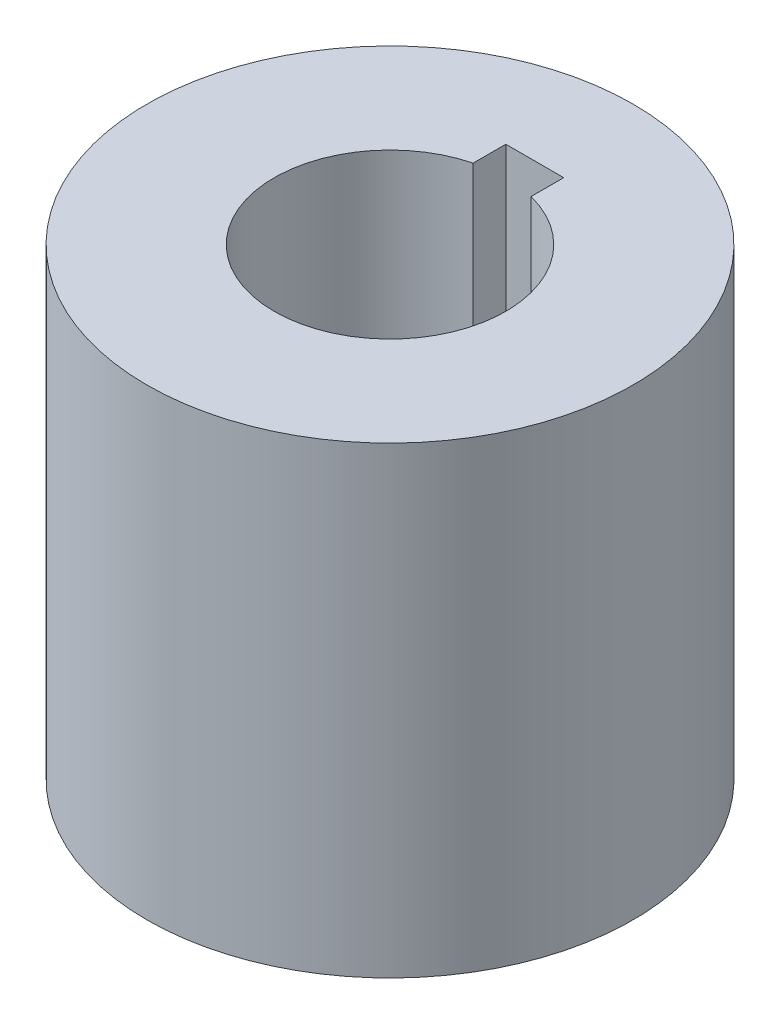
ISO-10303-21;
HEADER;
FILE_DESCRIPTION(('STEP AP214'),'2;1');
FILE_NAME('part.step','',(''),(''),'','','');
FILE_SCHEMA(('AUTOMOTIVE_DESIGN { 1 0 10303 214 1 1 1 1 }'));
ENDSEC;
DATA;
#1=APPLICATION_CONTEXT('core data for automotive mechanical design processes');
#2=APPLICATION_PROTOCOL_DEFINITION('international standard','automotive_design',2000,#1);
#3=PRODUCT_CONTEXT('',#1,'mechanical');
#4=PRODUCT('Part','Part','',(#3));
#5=PRODUCT_RELATED_PRODUCT_CATEGORY('part','',(#4));
#6=PRODUCT_DEFINITION_FORMATION('','',#4);
#7=PRODUCT_DEFINITION_CONTEXT('part definition',#1,'design');
#8=PRODUCT_DEFINITION('design','',#6,#7);
#9=PRODUCT_DEFINITION_SHAPE('','',#8);
#10=(LENGTH_UNIT() NAMED_UNIT(*) SI_UNIT(.MILLI.,.METRE.));
#11=(NAMED_UNIT(*) PLANE_ANGLE_UNIT() SI_UNIT($,.RADIAN.));
#12=(NAMED_UNIT(*) SI_UNIT($,.STERADIAN.) SOLID_ANGLE_UNIT());
#13=UNCERTAINTY_MEASURE_WITH_UNIT(LENGTH_MEASURE(1.E-05),#10,'distance_accuracy_value','');
#14=(GEOMETRIC_REPRESENTATION_CONTEXT(3) GLOBAL_UNCERTAINTY_ASSIGNED_CONTEXT((#13)) GLOBAL_UNIT_ASSIGNED_CONTEXT((#10,
#11,#12)) REPRESENTATION_CONTEXT('',''));
#15=CARTESIAN_POINT('',(0.,0.,0.));
#16=DIRECTION('',(0.,0.,1.));
#17=DIRECTION('',(1.,0.,0.));
#18=AXIS2_PLACEMENT_3D('',#15,#16,#17);
#19=CARTESIAN_POINT('',(-1.5875,25.4,-7.9375));
#20=DIRECTION('',(0.,0.,1.));
#21=DIRECTION('',(1.,0.,0.));
#22=AXIS2_PLACEMENT_3D('',#19,#20,#21);
#23=PLANE('',#22);
#24=DIRECTION('',(1.,0.,0.));
#25=VECTOR('',#24,1.);
#26=CARTESIAN_POINT('',(0.,25.4,-7.9375));
#27=LINE('',#26,#25);
#28=CARTESIAN_POINT('',(-1.5875,25.4,-7.9375));
#29=VERTEX_POINT('',#28);
#30=CARTESIAN_POINT('',(1.5875,25.4,-7.9375));
#31=VERTEX_POINT('',#30);
#32=EDGE_CURVE('E89',#29,#31,#27,.T.);
#33=ORIENTED_EDGE('',*,*,#32,.F.);
#34=DIRECTION('',(0.,1.,0.));
#35=VECTOR('',#34,1.);
#36=CARTESIAN_POINT('',(-1.5875,25.4,-7.9375));
#37=LINE('',#36,#35);
#38=CARTESIAN_POINT('',(-1.5875,0.,-7.9375));
#39=VERTEX_POINT('',#38);
#40=EDGE_CURVE('E56',#39,#29,#37,.T.);
#41=ORIENTED_EDGE('',*,*,#40,.F.);
#42=DIRECTION('',(1.,0.,0.));
#43=VECTOR('',#42,1.);
#44=CARTESIAN_POINT('',(0.,0.,-7.9375));
#45=LINE('',#44,#43);
#46=CARTESIAN_POINT('',(1.5875,0.,-7.9375));
#47=VERTEX_POINT('',#46);
#48=EDGE_CURVE('E65',#39,#47,#45,.T.);
#49=ORIENTED_EDGE('',*,*,#48,.T.);
#50=DIRECTION('',(0.,1.,0.));
#51=VECTOR('',#50,1.);
#52=CARTESIAN_POINT('',(1.5875,25.4,-7.9375));
#53=LINE('',#52,#51);
#54=EDGE_CURVE('E67',#31,#47,#53,.F.);
#55=ORIENTED_EDGE('',*,*,#54,.F.);
#56=EDGE_LOOP('',(#33,#41,#49,#55));
#57=FACE_BOUND('',#56,.T.);
#58=ADVANCED_FACE('F17',(#57),#23,.T.);
#59=CARTESIAN_POINT('',(1.5875,25.4,-7.9375));
#60=DIRECTION('',(-1.,0.,0.));
#61=DIRECTION('',(0.,0.,1.));
#62=AXIS2_PLACEMENT_3D('',#59,#60,#61);
#63=PLANE('',#62);
#64=DIRECTION('',(0.,0.,1.));
#65=VECTOR('',#64,1.);
#66=CARTESIAN_POINT('',(1.5875,25.4,0.));
#67=LINE('',#66,#65);
#68=CARTESIAN_POINT('',(1.5875,25.4,-6.14836106210427));
#69=VERTEX_POINT('',#68);
#70=EDGE_CURVE('E72',#31,#69,#67,.T.);
#71=ORIENTED_EDGE('',*,*,#70,.F.);
#72=ORIENTED_EDGE('',*,*,#54,.T.);
#73=DIRECTION('',(0.,0.,1.));
#74=VECTOR('',#73,1.);
#75=CARTESIAN_POINT('',(1.5875,0.,0.));
#76=LINE('',#75,#74);
#77=CARTESIAN_POINT('',(1.5875,0.,-6.14836106210427));
#78=VERTEX_POINT('',#77);
#79=EDGE_CURVE('E71',#47,#78,#76,.T.);
#80=ORIENTED_EDGE('',*,*,#79,.T.);
#81=DIRECTION('',(0.,-1.,0.));
#82=VECTOR('',#81,1.);
#83=CARTESIAN_POINT('',(1.5875,25.4,-6.14836106210427));
#84=LINE('',#83,#82);
#85=EDGE_CURVE('E45',#78,#69,#84,.F.);
#86=ORIENTED_EDGE('',*,*,#85,.T.);
#87=EDGE_LOOP('',(#71,#72,#80,#86));
#88=FACE_BOUND('',#87,.T.);
#89=ADVANCED_FACE('F74',(#88),#63,.T.);
#90=CARTESIAN_POINT('',(0.,25.4,0.));
#91=DIRECTION('',(0.,-1.,0.));
#92=DIRECTION('',(0.,0.,-1.));
#93=AXIS2_PLACEMENT_3D('',#90,#91,#92);
#94=CYLINDRICAL_SURFACE('',#93,6.35);
#95=DIRECTION('',(0.,1.,0.));
#96=VECTOR('',#95,1.);
#97=CARTESIAN_POINT('',(-1.5875,25.4,-6.14836106210428));
#98=LINE('',#97,#96);
#99=CARTESIAN_POINT('',(-1.5875,25.4,-6.14836106210428));
#100=VERTEX_POINT('',#99);
#101=CARTESIAN_POINT('',(-1.5875,0.,-6.14836106210428));
#102=VERTEX_POINT('',#101);
#103=EDGE_CURVE('E48',#100,#102,#98,.F.);
#104=ORIENTED_EDGE('',*,*,#103,.F.);
#105=CARTESIAN_POINT('',(0.,25.4,0.));
#106=DIRECTION('',(0.,-1.,0.));
#107=DIRECTION('',(0.,0.,-1.));
#108=AXIS2_PLACEMENT_3D('',#105,#106,#107);
#109=CIRCLE('',#108,6.35);
#110=EDGE_CURVE('E20',#69,#100,#109,.T.);
#111=ORIENTED_EDGE('',*,*,#110,.F.);
#112=ORIENTED_EDGE('',*,*,#85,.F.);
#113=CARTESIAN_POINT('',(0.,0.,0.));
#114=DIRECTION('',(0.,-1.,0.));
#115=DIRECTION('',(0.,0.,-1.));
#116=AXIS2_PLACEMENT_3D('',#113,#114,#115);
#117=CIRCLE('',#116,6.35);
#118=EDGE_CURVE('E35',#78,#102,#117,.T.);
#119=ORIENTED_EDGE('',*,*,#118,.T.);
#120=EDGE_LOOP('',(#104,#111,#112,#119));
#121=FACE_BOUND('',#120,.T.);
#122=ADVANCED_FACE('F117',(#121),#94,.F.);
#123=CARTESIAN_POINT('',(-1.5875,25.4,-7.9375));
#124=DIRECTION('',(1.,0.,0.));
#125=DIRECTION('',(0.,0.,-1.));
#126=AXIS2_PLACEMENT_3D('',#123,#124,#125);
#127=PLANE('',#126);
#128=DIRECTION('',(0.,0.,1.));
#129=VECTOR('',#128,1.);
#130=CARTESIAN_POINT('',(-1.5875,25.4,0.));
#131=LINE('',#130,#129);
#132=EDGE_CURVE('E92',#100,#29,#131,.F.);
#133=ORIENTED_EDGE('',*,*,#132,.F.);
#134=ORIENTED_EDGE('',*,*,#103,.T.);
#135=DIRECTION('',(0.,0.,1.));
#136=VECTOR('',#135,1.);
#137=CARTESIAN_POINT('',(-1.5875,0.,0.));
#138=LINE('',#137,#136);
#139=EDGE_CURVE('E81',#102,#39,#138,.F.);
#140=ORIENTED_EDGE('',*,*,#139,.T.);
#141=ORIENTED_EDGE('',*,*,#40,.T.);
#142=EDGE_LOOP('',(#133,#134,#140,#141));
#143=FACE_BOUND('',#142,.T.);
#144=ADVANCED_FACE('F112',(#143),#127,.T.);
#145=CARTESIAN_POINT('',(0.,25.4,0.));
#146=DIRECTION('',(0.,1.,0.));
#147=DIRECTION('',(0.,0.,1.));
#148=AXIS2_PLACEMENT_3D('',#145,#146,#147);
#149=PLANE('',#148);
#150=ORIENTED_EDGE('',*,*,#32,.T.);
#151=ORIENTED_EDGE('',*,*,#70,.T.);
#152=ORIENTED_EDGE('',*,*,#110,.T.);
#153=ORIENTED_EDGE('',*,*,#132,.T.);
#154=EDGE_LOOP('',(#150,#151,#152,#153));
#155=FACE_BOUND('',#154,.T.);
#156=CARTESIAN_POINT('',(0.,25.4,0.));
#157=DIRECTION('',(0.,-1.,0.));
#158=DIRECTION('',(0.,0.,-1.));
#159=AXIS2_PLACEMENT_3D('',#156,#157,#158);
#160=CIRCLE('',#159,13.335);
#161=CARTESIAN_POINT('',(0.,25.4,-13.335));
#162=VERTEX_POINT('',#161);
#163=EDGE_CURVE('E26',#162,#162,#160,.T.);
#164=ORIENTED_EDGE('',*,*,#163,.F.);
#165=EDGE_LOOP('',(#164));
#166=FACE_BOUND('',#165,.T.);
#167=ADVANCED_FACE('F115',(#155,#166),#149,.T.);
#168=CARTESIAN_POINT('',(0.,0.,0.));
#169=DIRECTION('',(0.,1.,0.));
#170=DIRECTION('',(0.,0.,1.));
#171=AXIS2_PLACEMENT_3D('',#168,#169,#170);
#172=PLANE('',#171);
#173=ORIENTED_EDGE('',*,*,#118,.F.);
#174=ORIENTED_EDGE('',*,*,#79,.F.);
#175=ORIENTED_EDGE('',*,*,#48,.F.);
#176=ORIENTED_EDGE('',*,*,#139,.F.);
#177=EDGE_LOOP('',(#173,#174,#175,#176));
#178=FACE_BOUND('',#177,.T.);
#179=CARTESIAN_POINT('',(0.,0.,0.));
#180=DIRECTION('',(0.,-1.,0.));
#181=DIRECTION('',(0.,0.,-1.));
#182=AXIS2_PLACEMENT_3D('',#179,#180,#181);
#183=CIRCLE('',#182,13.335);
#184=CARTESIAN_POINT('',(0.,0.,-13.335));
#185=VERTEX_POINT('',#184);
#186=EDGE_CURVE('E11',#185,#185,#183,.F.);
#187=ORIENTED_EDGE('',*,*,#186,.F.);
#188=EDGE_LOOP('',(#187));
#189=FACE_BOUND('',#188,.T.);
#190=ADVANCED_FACE('F78',(#178,#189),#172,.F.);
#191=CARTESIAN_POINT('',(0.,25.4,0.));
#192=DIRECTION('',(0.,-1.,0.));
#193=DIRECTION('',(0.,0.,-1.));
#194=AXIS2_PLACEMENT_3D('',#191,#192,#193);
#195=CYLINDRICAL_SURFACE('',#194,13.335);
#196=ORIENTED_EDGE('',*,*,#186,.T.);
#197=EDGE_LOOP('',(#196));
#198=FACE_BOUND('',#197,.T.);
#199=ORIENTED_EDGE('',*,*,#163,.T.);
#200=EDGE_LOOP('',(#199));
#201=FACE_BOUND('',#200,.T.);
#202=ADVANCED_FACE('F126',(#198,#201),#195,.T.);
#203=CLOSED_SHELL('',(#58,#89,#122,#144,#167,#190,#202));
#204=MANIFOLD_SOLID_BREP('B1',#203);
#205=ADVANCED_BREP_SHAPE_REPRESENTATION('',(#18,#204),#14);
#206=SHAPE_DEFINITION_REPRESENTATION(#9,#205);
ENDSEC;
END-ISO-10303-21;
